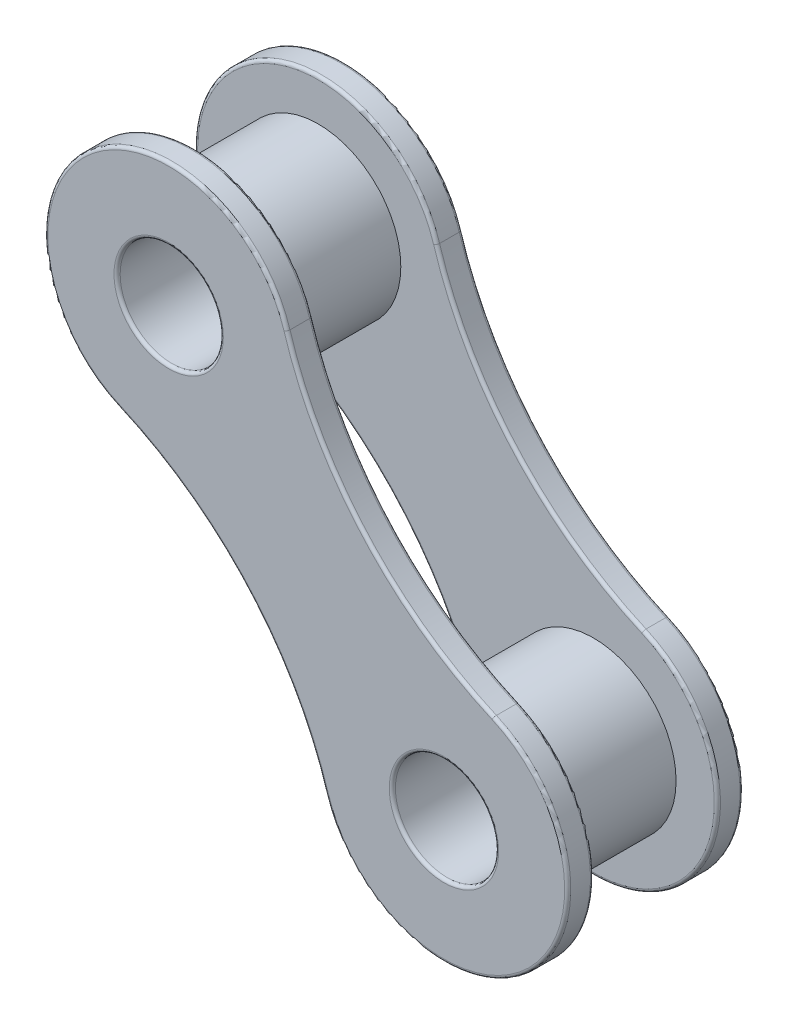
ISO-10303-21;
HEADER;
FILE_DESCRIPTION(('STEP AP214'),'2;1');
FILE_NAME('part.step','',(''),(''),'','','');
FILE_SCHEMA(('AUTOMOTIVE_DESIGN { 1 0 10303 214 1 1 1 1 }'));
ENDSEC;
DATA;
#1=APPLICATION_CONTEXT('core data for automotive mechanical design processes');
#2=APPLICATION_PROTOCOL_DEFINITION('international standard','automotive_design',2000,#1);
#3=PRODUCT_CONTEXT('',#1,'mechanical');
#4=PRODUCT('Part','Part','',(#3));
#5=PRODUCT_RELATED_PRODUCT_CATEGORY('part','',(#4));
#6=PRODUCT_DEFINITION_FORMATION('','',#4);
#7=PRODUCT_DEFINITION_CONTEXT('part definition',#1,'design');
#8=PRODUCT_DEFINITION('design','',#6,#7);
#9=PRODUCT_DEFINITION_SHAPE('','',#8);
#10=(LENGTH_UNIT() NAMED_UNIT(*) SI_UNIT(.MILLI.,.METRE.));
#11=(NAMED_UNIT(*) PLANE_ANGLE_UNIT() SI_UNIT($,.RADIAN.));
#12=(NAMED_UNIT(*) SI_UNIT($,.STERADIAN.) SOLID_ANGLE_UNIT());
#13=UNCERTAINTY_MEASURE_WITH_UNIT(LENGTH_MEASURE(1.E-05),#10,'distance_accuracy_value','');
#14=(GEOMETRIC_REPRESENTATION_CONTEXT(3) GLOBAL_UNCERTAINTY_ASSIGNED_CONTEXT((#13)) GLOBAL_UNIT_ASSIGNED_CONTEXT((#10,
#11,#12)) REPRESENTATION_CONTEXT('',''));
#15=CARTESIAN_POINT('',(0.,0.,0.));
#16=DIRECTION('',(0.,0.,1.));
#17=DIRECTION('',(1.,0.,0.));
#18=AXIS2_PLACEMENT_3D('',#15,#16,#17);
#19=CARTESIAN_POINT('',(63.2858407210555,49.9374865017428,3.));
#20=DIRECTION('',(0.,0.,1.));
#21=DIRECTION('',(1.,0.,0.));
#22=AXIS2_PLACEMENT_3D('',#19,#20,#21);
#23=PLANE('',#22);
#24=CARTESIAN_POINT('',(45.1534797470327,53.8384460641754,3.));
#25=DIRECTION('',(0.,0.,1.));
#26=DIRECTION('',(1.,0.,0.));
#27=AXIS2_PLACEMENT_3D('',#24,#25,#26);
#28=CIRCLE('',#27,5.85);
#29=CARTESIAN_POINT('',(42.8167210840747,48.4754190316973,3.));
#30=VERTEX_POINT('',#29);
#31=CARTESIAN_POINT('',(50.7416220659298,55.5691006870715,3.));
#32=VERTEX_POINT('',#31);
#33=EDGE_CURVE('E227',#30,#32,#28,.F.);
#34=ORIENTED_EDGE('',*,*,#33,.T.);
#35=CARTESIAN_POINT('',(68.0791918245591,60.9385675940056,3.));
#36=DIRECTION('',(0.,0.,1.));
#37=DIRECTION('',(1.,0.,0.));
#38=AXIS2_PLACEMENT_3D('',#35,#36,#37);
#39=CIRCLE('',#38,18.15);
#40=CARTESIAN_POINT('',(60.8292482805099,44.2994324419582,3.));
#41=VERTEX_POINT('',#40);
#42=EDGE_CURVE('E233',#32,#41,#39,.T.);
#43=ORIENTED_EDGE('',*,*,#42,.T.);
#44=CARTESIAN_POINT('',(58.4924896175519,38.9364054094801,3.));
#45=DIRECTION('',(0.,0.,1.));
#46=DIRECTION('',(1.,0.,0.));
#47=AXIS2_PLACEMENT_3D('',#44,#45,#46);
#48=CIRCLE('',#47,5.85000000000001);
#49=CARTESIAN_POINT('',(52.9043472986548,37.205750786584,3.));
#50=VERTEX_POINT('',#49);
#51=EDGE_CURVE('E231',#41,#50,#48,.F.);
#52=ORIENTED_EDGE('',*,*,#51,.T.);
#53=CARTESIAN_POINT('',(35.5667775400255,31.8362838796499,3.));
#54=DIRECTION('',(0.,0.,1.));
#55=DIRECTION('',(1.,0.,0.));
#56=AXIS2_PLACEMENT_3D('',#53,#54,#55);
#57=CIRCLE('',#56,18.15);
#58=EDGE_CURVE('E229',#50,#30,#57,.T.);
#59=ORIENTED_EDGE('',*,*,#58,.T.);
#60=EDGE_LOOP('',(#34,#43,#52,#59));
#61=FACE_BOUND('',#60,.T.);
#62=CARTESIAN_POINT('',(45.1534797470327,53.8384460641754,3.));
#63=DIRECTION('',(0.,0.,1.));
#64=DIRECTION('',(1.,0.,0.));
#65=AXIS2_PLACEMENT_3D('',#62,#63,#64);
#66=CIRCLE('',#65,4.00000000000001);
#67=CARTESIAN_POINT('',(49.1534797470327,53.8384460641754,3.));
#68=VERTEX_POINT('',#67);
#69=EDGE_CURVE('E337',#68,#68,#66,.T.);
#70=ORIENTED_EDGE('',*,*,#69,.T.);
#71=EDGE_LOOP('',(#70));
#72=FACE_BOUND('',#71,.T.);
#73=CARTESIAN_POINT('',(58.4924896175519,38.9364054094801,3.));
#74=DIRECTION('',(0.,0.,1.));
#75=DIRECTION('',(1.,0.,0.));
#76=AXIS2_PLACEMENT_3D('',#73,#74,#75);
#77=CIRCLE('',#76,4.);
#78=CARTESIAN_POINT('',(62.4924896175519,38.9364054094801,3.));
#79=VERTEX_POINT('',#78);
#80=EDGE_CURVE('E194',#79,#79,#77,.F.);
#81=ORIENTED_EDGE('',*,*,#80,.F.);
#82=EDGE_LOOP('',(#81));
#83=FACE_BOUND('',#82,.T.);
#84=ADVANCED_FACE('F36',(#61,#72,#83),#23,.F.);
#85=CARTESIAN_POINT('',(45.1534797470327,53.8384460641754,3.));
#86=DIRECTION('',(0.,0.,-1.));
#87=DIRECTION('',(-1.,0.,0.));
#88=AXIS2_PLACEMENT_3D('',#85,#86,#87);
#89=CYLINDRICAL_SURFACE('',#88,4.00000000000001);
#90=ORIENTED_EDGE('',*,*,#69,.F.);
#91=EDGE_LOOP('',(#90));
#92=FACE_BOUND('',#91,.T.);
#93=CARTESIAN_POINT('',(45.1534797470327,53.8384460641754,-3.));
#94=DIRECTION('',(0.,0.,1.));
#95=DIRECTION('',(1.,0.,0.));
#96=AXIS2_PLACEMENT_3D('',#93,#94,#95);
#97=CIRCLE('',#96,4.00000000000001);
#98=CARTESIAN_POINT('',(49.1534797470327,53.8384460641754,-3.));
#99=VERTEX_POINT('',#98);
#100=EDGE_CURVE('E331',#99,#99,#97,.T.);
#101=ORIENTED_EDGE('',*,*,#100,.T.);
#102=EDGE_LOOP('',(#101));
#103=FACE_BOUND('',#102,.T.);
#104=ADVANCED_FACE('F349',(#92,#103),#89,.T.);
#105=CARTESIAN_POINT('',(45.1534797470327,53.8384460641754,3.));
#106=DIRECTION('',(0.,0.,-1.));
#107=DIRECTION('',(-1.,0.,0.));
#108=AXIS2_PLACEMENT_3D('',#105,#106,#107);
#109=CYLINDRICAL_SURFACE('',#108,2.5);
#110=CARTESIAN_POINT('',(45.1534797470327,53.8384460641754,-4.1));
#111=DIRECTION('',(0.,0.,-1.));
#112=DIRECTION('',(-1.,0.,0.));
#113=AXIS2_PLACEMENT_3D('',#110,#111,#112);
#114=CIRCLE('',#113,2.5);
#115=CARTESIAN_POINT('',(42.6534797470327,53.8384460641754,-4.1));
#116=VERTEX_POINT('',#115);
#117=EDGE_CURVE('E259',#116,#116,#114,.T.);
#118=ORIENTED_EDGE('',*,*,#117,.T.);
#119=EDGE_LOOP('',(#118));
#120=FACE_BOUND('',#119,.T.);
#121=CARTESIAN_POINT('',(45.1534797470327,53.8384460641754,4.1));
#122=DIRECTION('',(0.,0.,1.));
#123=DIRECTION('',(1.,0.,0.));
#124=AXIS2_PLACEMENT_3D('',#121,#122,#123);
#125=CIRCLE('',#124,2.5);
#126=CARTESIAN_POINT('',(47.6534797470327,53.8384460641754,4.1));
#127=VERTEX_POINT('',#126);
#128=EDGE_CURVE('E256',#127,#127,#125,.T.);
#129=ORIENTED_EDGE('',*,*,#128,.T.);
#130=EDGE_LOOP('',(#129));
#131=FACE_BOUND('',#130,.T.);
#132=ADVANCED_FACE('F355',(#120,#131),#109,.F.);
#133=CARTESIAN_POINT('',(63.2858407210555,49.9374865017428,4.25));
#134=DIRECTION('',(0.,0.,1.));
#135=DIRECTION('',(1.,0.,0.));
#136=AXIS2_PLACEMENT_3D('',#133,#134,#135);
#137=PLANE('',#136);
#138=CARTESIAN_POINT('',(58.4924896175519,38.9364054094801,4.25));
#139=DIRECTION('',(0.,0.,1.));
#140=DIRECTION('',(1.,0.,0.));
#141=AXIS2_PLACEMENT_3D('',#138,#139,#140);
#142=CIRCLE('',#141,2.65);
#143=CARTESIAN_POINT('',(61.1424896175519,38.9364054094801,4.25));
#144=VERTEX_POINT('',#143);
#145=EDGE_CURVE('E253',#144,#144,#142,.F.);
#146=ORIENTED_EDGE('',*,*,#145,.T.);
#147=EDGE_LOOP('',(#146));
#148=FACE_BOUND('',#147,.T.);
#149=CARTESIAN_POINT('',(45.1534797470327,53.8384460641754,4.25));
#150=DIRECTION('',(0.,0.,1.));
#151=DIRECTION('',(1.,0.,0.));
#152=AXIS2_PLACEMENT_3D('',#149,#150,#151);
#153=CIRCLE('',#152,2.65);
#154=CARTESIAN_POINT('',(47.8034797470327,53.8384460641754,4.25));
#155=VERTEX_POINT('',#154);
#156=EDGE_CURVE('E250',#155,#155,#153,.F.);
#157=ORIENTED_EDGE('',*,*,#156,.T.);
#158=EDGE_LOOP('',(#157));
#159=FACE_BOUND('',#158,.T.);
#160=CARTESIAN_POINT('',(58.4924896175519,38.9364054094801,4.25));
#161=DIRECTION('',(0.,0.,1.));
#162=DIRECTION('',(1.,0.,0.));
#163=AXIS2_PLACEMENT_3D('',#160,#161,#162);
#164=CIRCLE('',#163,5.85000000000001);
#165=CARTESIAN_POINT('',(52.9043472986548,37.205750786584,4.25));
#166=VERTEX_POINT('',#165);
#167=CARTESIAN_POINT('',(60.8292482805099,44.2994324419582,4.25));
#168=VERTEX_POINT('',#167);
#169=EDGE_CURVE('E53',#166,#168,#164,.T.);
#170=ORIENTED_EDGE('',*,*,#169,.T.);
#171=CARTESIAN_POINT('',(68.0791918245591,60.9385675940056,4.25));
#172=DIRECTION('',(0.,0.,1.));
#173=DIRECTION('',(1.,0.,0.));
#174=AXIS2_PLACEMENT_3D('',#171,#172,#173);
#175=CIRCLE('',#174,18.15);
#176=CARTESIAN_POINT('',(50.7416220659298,55.5691006870715,4.25));
#177=VERTEX_POINT('',#176);
#178=EDGE_CURVE('E248',#168,#177,#175,.F.);
#179=ORIENTED_EDGE('',*,*,#178,.T.);
#180=CARTESIAN_POINT('',(45.1534797470327,53.8384460641754,4.25));
#181=DIRECTION('',(0.,0.,1.));
#182=DIRECTION('',(1.,0.,0.));
#183=AXIS2_PLACEMENT_3D('',#180,#181,#182);
#184=CIRCLE('',#183,5.85);
#185=CARTESIAN_POINT('',(42.8167210840747,48.4754190316973,4.25));
#186=VERTEX_POINT('',#185);
#187=EDGE_CURVE('E244',#177,#186,#184,.T.);
#188=ORIENTED_EDGE('',*,*,#187,.T.);
#189=CARTESIAN_POINT('',(35.5667775400255,31.8362838796499,4.25));
#190=DIRECTION('',(0.,0.,1.));
#191=DIRECTION('',(1.,0.,0.));
#192=AXIS2_PLACEMENT_3D('',#189,#190,#191);
#193=CIRCLE('',#192,18.15);
#194=EDGE_CURVE('E58',#186,#166,#193,.F.);
#195=ORIENTED_EDGE('',*,*,#194,.T.);
#196=EDGE_LOOP('',(#170,#179,#188,#195));
#197=FACE_BOUND('',#196,.T.);
#198=ADVANCED_FACE('F361',(#148,#159,#197),#137,.T.);
#199=CARTESIAN_POINT('',(58.4924896175519,38.9364054094801,4.25));
#200=DIRECTION('',(0.,0.,-1.));
#201=DIRECTION('',(-1.,0.,0.));
#202=AXIS2_PLACEMENT_3D('',#199,#200,#201);
#203=CYLINDRICAL_SURFACE('',#202,6.00000000000001);
#204=DIRECTION('',(0.,0.,-1.));
#205=VECTOR('',#204,1.);
#206=CARTESIAN_POINT('',(52.7610615981703,37.1613750270225,4.25));
#207=LINE('',#206,#205);
#208=CARTESIAN_POINT('',(52.7610615981703,37.1613750270225,4.1));
#209=VERTEX_POINT('',#208);
#210=CARTESIAN_POINT('',(52.7610615981703,37.1613750270225,3.15));
#211=VERTEX_POINT('',#210);
#212=EDGE_CURVE('E321',#209,#211,#207,.T.);
#213=ORIENTED_EDGE('',*,*,#212,.T.);
#214=CARTESIAN_POINT('',(58.4924896175519,38.9364054094801,3.15));
#215=DIRECTION('',(0.,0.,1.));
#216=DIRECTION('',(1.,0.,0.));
#217=AXIS2_PLACEMENT_3D('',#214,#215,#216);
#218=CIRCLE('',#217,6.00000000000001);
#219=CARTESIAN_POINT('',(60.8891651693037,44.4369459556115,3.15));
#220=VERTEX_POINT('',#219);
#221=EDGE_CURVE('E238',#211,#220,#218,.T.);
#222=ORIENTED_EDGE('',*,*,#221,.T.);
#223=DIRECTION('',(0.,0.,-1.));
#224=VECTOR('',#223,1.);
#225=CARTESIAN_POINT('',(60.8891651693037,44.4369459556115,4.25));
#226=LINE('',#225,#224);
#227=CARTESIAN_POINT('',(60.8891651693037,44.4369459556115,4.1));
#228=VERTEX_POINT('',#227);
#229=EDGE_CURVE('E329',#228,#220,#226,.T.);
#230=ORIENTED_EDGE('',*,*,#229,.F.);
#231=CARTESIAN_POINT('',(58.4924896175519,38.9364054094801,4.1));
#232=DIRECTION('',(0.,0.,1.));
#233=DIRECTION('',(1.,0.,0.));
#234=AXIS2_PLACEMENT_3D('',#231,#232,#233);
#235=CIRCLE('',#234,6.00000000000001);
#236=EDGE_CURVE('E236',#228,#209,#235,.F.);
#237=ORIENTED_EDGE('',*,*,#236,.T.);
#238=EDGE_LOOP('',(#213,#222,#230,#237));
#239=FACE_BOUND('',#238,.T.);
#240=ADVANCED_FACE('F371',(#239),#203,.T.);
#241=CARTESIAN_POINT('',(68.0791918245591,60.9385675940056,4.25));
#242=DIRECTION('',(0.,0.,-1.));
#243=DIRECTION('',(-1.,0.,0.));
#244=AXIS2_PLACEMENT_3D('',#241,#242,#243);
#245=CYLINDRICAL_SURFACE('',#244,18.);
#246=ORIENTED_EDGE('',*,*,#229,.T.);
#247=CARTESIAN_POINT('',(68.0791918245591,60.9385675940056,3.15));
#248=DIRECTION('',(0.,0.,1.));
#249=DIRECTION('',(1.,0.,0.));
#250=AXIS2_PLACEMENT_3D('',#247,#248,#249);
#251=CIRCLE('',#250,18.);
#252=CARTESIAN_POINT('',(50.8849077664143,55.6134764466329,3.15));
#253=VERTEX_POINT('',#252);
#254=EDGE_CURVE('E224',#220,#253,#251,.F.);
#255=ORIENTED_EDGE('',*,*,#254,.T.);
#256=DIRECTION('',(0.,0.,-1.));
#257=VECTOR('',#256,1.);
#258=CARTESIAN_POINT('',(50.8849077664143,55.6134764466329,4.25));
#259=LINE('',#258,#257);
#260=CARTESIAN_POINT('',(50.8849077664143,55.6134764466329,4.1));
#261=VERTEX_POINT('',#260);
#262=EDGE_CURVE('E327',#261,#253,#259,.T.);
#263=ORIENTED_EDGE('',*,*,#262,.F.);
#264=CARTESIAN_POINT('',(68.0791918245591,60.9385675940056,4.1));
#265=DIRECTION('',(0.,0.,1.));
#266=DIRECTION('',(1.,0.,0.));
#267=AXIS2_PLACEMENT_3D('',#264,#265,#266);
#268=CIRCLE('',#267,18.);
#269=EDGE_CURVE('E221',#261,#228,#268,.T.);
#270=ORIENTED_EDGE('',*,*,#269,.T.);
#271=EDGE_LOOP('',(#246,#255,#263,#270));
#272=FACE_BOUND('',#271,.T.);
#273=ADVANCED_FACE('F368',(#272),#245,.F.);
#274=CARTESIAN_POINT('',(45.1534797470327,53.8384460641754,4.25));
#275=DIRECTION('',(0.,0.,-1.));
#276=DIRECTION('',(-1.,0.,0.));
#277=AXIS2_PLACEMENT_3D('',#274,#275,#276);
#278=CYLINDRICAL_SURFACE('',#277,6.00000000000001);
#279=ORIENTED_EDGE('',*,*,#262,.T.);
#280=CARTESIAN_POINT('',(45.1534797470327,53.8384460641754,3.15));
#281=DIRECTION('',(0.,0.,1.));
#282=DIRECTION('',(1.,0.,0.));
#283=AXIS2_PLACEMENT_3D('',#280,#281,#282);
#284=CIRCLE('',#283,6.00000000000001);
#285=CARTESIAN_POINT('',(42.7568041952809,48.337905518044,3.15));
#286=VERTEX_POINT('',#285);
#287=EDGE_CURVE('E11',#253,#286,#284,.T.);
#288=ORIENTED_EDGE('',*,*,#287,.T.);
#289=DIRECTION('',(0.,0.,-1.));
#290=VECTOR('',#289,1.);
#291=CARTESIAN_POINT('',(42.7568041952809,48.337905518044,4.25));
#292=LINE('',#291,#290);
#293=CARTESIAN_POINT('',(42.7568041952809,48.337905518044,4.1));
#294=VERTEX_POINT('',#293);
#295=EDGE_CURVE('E318',#294,#286,#292,.T.);
#296=ORIENTED_EDGE('',*,*,#295,.F.);
#297=CARTESIAN_POINT('',(45.1534797470327,53.8384460641754,4.1));
#298=DIRECTION('',(0.,0.,1.));
#299=DIRECTION('',(1.,0.,0.));
#300=AXIS2_PLACEMENT_3D('',#297,#298,#299);
#301=CIRCLE('',#300,6.00000000000001);
#302=EDGE_CURVE('E45',#294,#261,#301,.F.);
#303=ORIENTED_EDGE('',*,*,#302,.T.);
#304=EDGE_LOOP('',(#279,#288,#296,#303));
#305=FACE_BOUND('',#304,.T.);
#306=ADVANCED_FACE('F324',(#305),#278,.T.);
#307=CARTESIAN_POINT('',(35.5667775400255,31.8362838796499,4.25));
#308=DIRECTION('',(0.,0.,-1.));
#309=DIRECTION('',(-1.,0.,0.));
#310=AXIS2_PLACEMENT_3D('',#307,#308,#309);
#311=CYLINDRICAL_SURFACE('',#310,18.);
#312=ORIENTED_EDGE('',*,*,#295,.T.);
#313=CARTESIAN_POINT('',(35.5667775400255,31.8362838796499,3.15));
#314=DIRECTION('',(0.,0.,1.));
#315=DIRECTION('',(1.,0.,0.));
#316=AXIS2_PLACEMENT_3D('',#313,#314,#315);
#317=CIRCLE('',#316,18.);
#318=EDGE_CURVE('E242',#286,#211,#317,.F.);
#319=ORIENTED_EDGE('',*,*,#318,.T.);
#320=ORIENTED_EDGE('',*,*,#212,.F.);
#321=CARTESIAN_POINT('',(35.5667775400255,31.8362838796499,4.1));
#322=DIRECTION('',(0.,0.,1.));
#323=DIRECTION('',(1.,0.,0.));
#324=AXIS2_PLACEMENT_3D('',#321,#322,#323);
#325=CIRCLE('',#324,18.);
#326=EDGE_CURVE('E240',#209,#294,#325,.T.);
#327=ORIENTED_EDGE('',*,*,#326,.T.);
#328=EDGE_LOOP('',(#312,#319,#320,#327));
#329=FACE_BOUND('',#328,.T.);
#330=ADVANCED_FACE('F317',(#329),#311,.F.);
#331=CARTESIAN_POINT('',(58.4924896175519,38.9364054094801,4.25));
#332=DIRECTION('',(0.,0.,-1.));
#333=DIRECTION('',(-1.,0.,0.));
#334=AXIS2_PLACEMENT_3D('',#331,#332,#333);
#335=CYLINDRICAL_SURFACE('',#334,2.5);
#336=CARTESIAN_POINT('',(58.4924896175519,38.9364054094801,-4.1));
#337=DIRECTION('',(0.,0.,-1.));
#338=DIRECTION('',(-1.,0.,0.));
#339=AXIS2_PLACEMENT_3D('',#336,#337,#338);
#340=CIRCLE('',#339,2.5);
#341=CARTESIAN_POINT('',(55.9924896175519,38.9364054094801,-4.1));
#342=VERTEX_POINT('',#341);
#343=EDGE_CURVE('E265',#342,#342,#340,.T.);
#344=ORIENTED_EDGE('',*,*,#343,.T.);
#345=EDGE_LOOP('',(#344));
#346=FACE_BOUND('',#345,.T.);
#347=CARTESIAN_POINT('',(58.4924896175519,38.9364054094801,4.1));
#348=DIRECTION('',(0.,0.,1.));
#349=DIRECTION('',(1.,0.,0.));
#350=AXIS2_PLACEMENT_3D('',#347,#348,#349);
#351=CIRCLE('',#350,2.5);
#352=CARTESIAN_POINT('',(60.9924896175519,38.9364054094801,4.1));
#353=VERTEX_POINT('',#352);
#354=EDGE_CURVE('E262',#353,#353,#351,.T.);
#355=ORIENTED_EDGE('',*,*,#354,.T.);
#356=EDGE_LOOP('',(#355));
#357=FACE_BOUND('',#356,.T.);
#358=ADVANCED_FACE('F365',(#346,#357),#335,.F.);
#359=CARTESIAN_POINT('',(58.4924896175519,38.9364054094801,3.));
#360=DIRECTION('',(0.,0.,-1.));
#361=DIRECTION('',(-1.,0.,0.));
#362=AXIS2_PLACEMENT_3D('',#359,#360,#361);
#363=CYLINDRICAL_SURFACE('',#362,4.);
#364=ORIENTED_EDGE('',*,*,#80,.T.);
#365=EDGE_LOOP('',(#364));
#366=FACE_BOUND('',#365,.T.);
#367=CARTESIAN_POINT('',(58.4924896175519,38.9364054094801,-3.));
#368=DIRECTION('',(0.,0.,1.));
#369=DIRECTION('',(1.,0.,0.));
#370=AXIS2_PLACEMENT_3D('',#367,#368,#369);
#371=CIRCLE('',#370,4.);
#372=CARTESIAN_POINT('',(62.4924896175519,38.9364054094801,-3.));
#373=VERTEX_POINT('',#372);
#374=EDGE_CURVE('E341',#373,#373,#371,.T.);
#375=ORIENTED_EDGE('',*,*,#374,.T.);
#376=EDGE_LOOP('',(#375));
#377=FACE_BOUND('',#376,.T.);
#378=ADVANCED_FACE('F345',(#366,#377),#363,.T.);
#379=CARTESIAN_POINT('',(58.4924896175519,38.9364054094801,-4.25));
#380=DIRECTION('',(0.,0.,1.));
#381=DIRECTION('',(1.,0.,0.));
#382=AXIS2_PLACEMENT_3D('',#379,#380,#381);
#383=CYLINDRICAL_SURFACE('',#382,6.00000000000001);
#384=DIRECTION('',(0.,0.,1.));
#385=VECTOR('',#384,1.);
#386=CARTESIAN_POINT('',(52.7610615981703,37.1613750270225,-4.25));
#387=LINE('',#386,#385);
#388=CARTESIAN_POINT('',(52.7610615981703,37.1613750270225,-4.1));
#389=VERTEX_POINT('',#388);
#390=CARTESIAN_POINT('',(52.7610615981703,37.1613750270225,-3.15));
#391=VERTEX_POINT('',#390);
#392=EDGE_CURVE('E156',#389,#391,#387,.T.);
#393=ORIENTED_EDGE('',*,*,#392,.F.);
#394=CARTESIAN_POINT('',(58.4924896175519,38.9364054094801,-4.1));
#395=DIRECTION('',(0.,0.,-1.));
#396=DIRECTION('',(-1.,0.,0.));
#397=AXIS2_PLACEMENT_3D('',#394,#395,#396);
#398=CIRCLE('',#397,6.00000000000001);
#399=CARTESIAN_POINT('',(60.8891651693037,44.4369459556115,-4.1));
#400=VERTEX_POINT('',#399);
#401=EDGE_CURVE('E151',#389,#400,#398,.F.);
#402=ORIENTED_EDGE('',*,*,#401,.T.);
#403=DIRECTION('',(0.,0.,1.));
#404=VECTOR('',#403,1.);
#405=CARTESIAN_POINT('',(60.8891651693037,44.4369459556115,-4.25));
#406=LINE('',#405,#404);
#407=CARTESIAN_POINT('',(60.8891651693037,44.4369459556115,-3.15));
#408=VERTEX_POINT('',#407);
#409=EDGE_CURVE('E154',#400,#408,#406,.T.);
#410=ORIENTED_EDGE('',*,*,#409,.T.);
#411=CARTESIAN_POINT('',(58.4924896175519,38.9364054094801,-3.15));
#412=DIRECTION('',(0.,0.,-1.));
#413=DIRECTION('',(-1.,0.,0.));
#414=AXIS2_PLACEMENT_3D('',#411,#412,#413);
#415=CIRCLE('',#414,6.00000000000001);
#416=EDGE_CURVE('E162',#408,#391,#415,.T.);
#417=ORIENTED_EDGE('',*,*,#416,.T.);
#418=EDGE_LOOP('',(#393,#402,#410,#417));
#419=FACE_BOUND('',#418,.T.);
#420=ADVANCED_FACE('F153',(#419),#383,.T.);
#421=CARTESIAN_POINT('',(35.5667775400255,31.8362838796499,-4.25));
#422=DIRECTION('',(0.,0.,1.));
#423=DIRECTION('',(1.,0.,0.));
#424=AXIS2_PLACEMENT_3D('',#421,#422,#423);
#425=CYLINDRICAL_SURFACE('',#424,18.);
#426=DIRECTION('',(0.,0.,1.));
#427=VECTOR('',#426,1.);
#428=CARTESIAN_POINT('',(42.7568041952809,48.337905518044,-4.25));
#429=LINE('',#428,#427);
#430=CARTESIAN_POINT('',(42.7568041952809,48.337905518044,-4.1));
#431=VERTEX_POINT('',#430);
#432=CARTESIAN_POINT('',(42.7568041952809,48.337905518044,-3.15));
#433=VERTEX_POINT('',#432);
#434=EDGE_CURVE('E489',#431,#433,#429,.T.);
#435=ORIENTED_EDGE('',*,*,#434,.F.);
#436=CARTESIAN_POINT('',(35.5667775400255,31.8362838796499,-4.1));
#437=DIRECTION('',(0.,0.,-1.));
#438=DIRECTION('',(-1.,0.,0.));
#439=AXIS2_PLACEMENT_3D('',#436,#437,#438);
#440=CIRCLE('',#439,18.);
#441=EDGE_CURVE('E210',#431,#389,#440,.T.);
#442=ORIENTED_EDGE('',*,*,#441,.T.);
#443=ORIENTED_EDGE('',*,*,#392,.T.);
#444=CARTESIAN_POINT('',(35.5667775400255,31.8362838796499,-3.15));
#445=DIRECTION('',(0.,0.,-1.));
#446=DIRECTION('',(-1.,0.,0.));
#447=AXIS2_PLACEMENT_3D('',#444,#445,#446);
#448=CIRCLE('',#447,18.);
#449=EDGE_CURVE('E161',#391,#433,#448,.F.);
#450=ORIENTED_EDGE('',*,*,#449,.T.);
#451=EDGE_LOOP('',(#435,#442,#443,#450));
#452=FACE_BOUND('',#451,.T.);
#453=ADVANCED_FACE('F462',(#452),#425,.F.);
#454=CARTESIAN_POINT('',(45.1534797470327,53.8384460641754,-4.25));
#455=DIRECTION('',(0.,0.,1.));
#456=DIRECTION('',(1.,0.,0.));
#457=AXIS2_PLACEMENT_3D('',#454,#455,#456);
#458=CYLINDRICAL_SURFACE('',#457,6.00000000000001);
#459=DIRECTION('',(0.,0.,1.));
#460=VECTOR('',#459,1.);
#461=CARTESIAN_POINT('',(50.8849077664143,55.6134764466329,-4.25));
#462=LINE('',#461,#460);
#463=CARTESIAN_POINT('',(50.8849077664143,55.6134764466329,-4.1));
#464=VERTEX_POINT('',#463);
#465=CARTESIAN_POINT('',(50.8849077664143,55.6134764466329,-3.15));
#466=VERTEX_POINT('',#465);
#467=EDGE_CURVE('E174',#464,#466,#462,.T.);
#468=ORIENTED_EDGE('',*,*,#467,.F.);
#469=CARTESIAN_POINT('',(45.1534797470327,53.8384460641754,-4.1));
#470=DIRECTION('',(0.,0.,-1.));
#471=DIRECTION('',(-1.,0.,0.));
#472=AXIS2_PLACEMENT_3D('',#469,#470,#471);
#473=CIRCLE('',#472,6.00000000000001);
#474=EDGE_CURVE('E270',#464,#431,#473,.F.);
#475=ORIENTED_EDGE('',*,*,#474,.T.);
#476=ORIENTED_EDGE('',*,*,#434,.T.);
#477=CARTESIAN_POINT('',(45.1534797470327,53.8384460641754,-3.15));
#478=DIRECTION('',(0.,0.,-1.));
#479=DIRECTION('',(-1.,0.,0.));
#480=AXIS2_PLACEMENT_3D('',#477,#478,#479);
#481=CIRCLE('',#480,6.00000000000001);
#482=EDGE_CURVE('E268',#433,#466,#481,.T.);
#483=ORIENTED_EDGE('',*,*,#482,.T.);
#484=EDGE_LOOP('',(#468,#475,#476,#483));
#485=FACE_BOUND('',#484,.T.);
#486=ADVANCED_FACE('F465',(#485),#458,.T.);
#487=CARTESIAN_POINT('',(68.0791918245591,60.9385675940056,-4.25));
#488=DIRECTION('',(0.,0.,1.));
#489=DIRECTION('',(1.,0.,0.));
#490=AXIS2_PLACEMENT_3D('',#487,#488,#489);
#491=CYLINDRICAL_SURFACE('',#490,18.);
#492=ORIENTED_EDGE('',*,*,#409,.F.);
#493=CARTESIAN_POINT('',(68.0791918245591,60.9385675940056,-4.1));
#494=DIRECTION('',(0.,0.,-1.));
#495=DIRECTION('',(-1.,0.,0.));
#496=AXIS2_PLACEMENT_3D('',#493,#494,#495);
#497=CIRCLE('',#496,18.);
#498=EDGE_CURVE('E170',#400,#464,#497,.T.);
#499=ORIENTED_EDGE('',*,*,#498,.T.);
#500=ORIENTED_EDGE('',*,*,#467,.T.);
#501=CARTESIAN_POINT('',(68.0791918245591,60.9385675940056,-3.15));
#502=DIRECTION('',(0.,0.,-1.));
#503=DIRECTION('',(-1.,0.,0.));
#504=AXIS2_PLACEMENT_3D('',#501,#502,#503);
#505=CIRCLE('',#504,18.);
#506=EDGE_CURVE('E173',#466,#408,#505,.F.);
#507=ORIENTED_EDGE('',*,*,#506,.T.);
#508=EDGE_LOOP('',(#492,#499,#500,#507));
#509=FACE_BOUND('',#508,.T.);
#510=ADVANCED_FACE('F167',(#509),#491,.F.);
#511=CARTESIAN_POINT('',(63.2858407210555,49.9374865017428,-4.25));
#512=DIRECTION('',(0.,0.,-1.));
#513=DIRECTION('',(1.,0.,0.));
#514=AXIS2_PLACEMENT_3D('',#511,#512,#513);
#515=PLANE('',#514);
#516=CARTESIAN_POINT('',(45.1534797470327,53.8384460641754,-4.25));
#517=DIRECTION('',(0.,0.,-1.));
#518=DIRECTION('',(-1.,0.,0.));
#519=AXIS2_PLACEMENT_3D('',#516,#517,#518);
#520=CIRCLE('',#519,2.65);
#521=CARTESIAN_POINT('',(42.5034797470327,53.8384460641754,-4.25));
#522=VERTEX_POINT('',#521);
#523=EDGE_CURVE('E205',#522,#522,#520,.F.);
#524=ORIENTED_EDGE('',*,*,#523,.T.);
#525=EDGE_LOOP('',(#524));
#526=FACE_BOUND('',#525,.T.);
#527=CARTESIAN_POINT('',(58.4924896175519,38.9364054094801,-4.25));
#528=DIRECTION('',(0.,0.,-1.));
#529=DIRECTION('',(-1.,0.,0.));
#530=AXIS2_PLACEMENT_3D('',#527,#528,#529);
#531=CIRCLE('',#530,2.65);
#532=CARTESIAN_POINT('',(55.8424896175519,38.9364054094801,-4.25));
#533=VERTEX_POINT('',#532);
#534=EDGE_CURVE('E202',#533,#533,#531,.F.);
#535=ORIENTED_EDGE('',*,*,#534,.T.);
#536=EDGE_LOOP('',(#535));
#537=FACE_BOUND('',#536,.T.);
#538=CARTESIAN_POINT('',(45.1534797470327,53.8384460641754,-4.25));
#539=DIRECTION('',(0.,0.,-1.));
#540=DIRECTION('',(-1.,0.,0.));
#541=AXIS2_PLACEMENT_3D('',#538,#539,#540);
#542=CIRCLE('',#541,5.85);
#543=CARTESIAN_POINT('',(42.8167210840747,48.4754190316973,-4.25));
#544=VERTEX_POINT('',#543);
#545=CARTESIAN_POINT('',(50.7416220659298,55.5691006870715,-4.25));
#546=VERTEX_POINT('',#545);
#547=EDGE_CURVE('E190',#544,#546,#542,.T.);
#548=ORIENTED_EDGE('',*,*,#547,.T.);
#549=CARTESIAN_POINT('',(68.0791918245591,60.9385675940056,-4.25));
#550=DIRECTION('',(0.,0.,-1.));
#551=DIRECTION('',(-1.,0.,0.));
#552=AXIS2_PLACEMENT_3D('',#549,#550,#551);
#553=CIRCLE('',#552,18.15);
#554=CARTESIAN_POINT('',(60.8292482805099,44.2994324419582,-4.25));
#555=VERTEX_POINT('',#554);
#556=EDGE_CURVE('E200',#546,#555,#553,.F.);
#557=ORIENTED_EDGE('',*,*,#556,.T.);
#558=CARTESIAN_POINT('',(58.4924896175519,38.9364054094801,-4.25));
#559=DIRECTION('',(0.,0.,-1.));
#560=DIRECTION('',(-1.,0.,0.));
#561=AXIS2_PLACEMENT_3D('',#558,#559,#560);
#562=CIRCLE('',#561,5.85000000000001);
#563=CARTESIAN_POINT('',(52.9043472986548,37.205750786584,-4.25));
#564=VERTEX_POINT('',#563);
#565=EDGE_CURVE('E180',#555,#564,#562,.T.);
#566=ORIENTED_EDGE('',*,*,#565,.T.);
#567=CARTESIAN_POINT('',(35.5667775400255,31.8362838796499,-4.25));
#568=DIRECTION('',(0.,0.,-1.));
#569=DIRECTION('',(-1.,0.,0.));
#570=AXIS2_PLACEMENT_3D('',#567,#568,#569);
#571=CIRCLE('',#570,18.15);
#572=EDGE_CURVE('E192',#564,#544,#571,.F.);
#573=ORIENTED_EDGE('',*,*,#572,.T.);
#574=EDGE_LOOP('',(#548,#557,#566,#573));
#575=FACE_BOUND('',#574,.T.);
#576=ADVANCED_FACE('F472',(#526,#537,#575),#515,.T.);
#577=CARTESIAN_POINT('',(63.2858407210555,49.9374865017428,-3.));
#578=DIRECTION('',(0.,0.,-1.));
#579=DIRECTION('',(1.,0.,0.));
#580=AXIS2_PLACEMENT_3D('',#577,#578,#579);
#581=PLANE('',#580);
#582=CARTESIAN_POINT('',(58.4924896175519,38.9364054094801,-3.));
#583=DIRECTION('',(0.,0.,-1.));
#584=DIRECTION('',(-1.,0.,0.));
#585=AXIS2_PLACEMENT_3D('',#582,#583,#584);
#586=CIRCLE('',#585,5.85000000000001);
#587=CARTESIAN_POINT('',(52.9043472986548,37.205750786584,-3.));
#588=VERTEX_POINT('',#587);
#589=CARTESIAN_POINT('',(60.8292482805099,44.2994324419582,-3.));
#590=VERTEX_POINT('',#589);
#591=EDGE_CURVE('E216',#588,#590,#586,.F.);
#592=ORIENTED_EDGE('',*,*,#591,.T.);
#593=CARTESIAN_POINT('',(68.0791918245591,60.9385675940056,-3.));
#594=DIRECTION('',(0.,0.,-1.));
#595=DIRECTION('',(-1.,0.,0.));
#596=AXIS2_PLACEMENT_3D('',#593,#594,#595);
#597=CIRCLE('',#596,18.15);
#598=CARTESIAN_POINT('',(50.7416220659298,55.5691006870715,-3.));
#599=VERTEX_POINT('',#598);
#600=EDGE_CURVE('E218',#590,#599,#597,.T.);
#601=ORIENTED_EDGE('',*,*,#600,.T.);
#602=CARTESIAN_POINT('',(45.1534797470327,53.8384460641754,-3.));
#603=DIRECTION('',(0.,0.,-1.));
#604=DIRECTION('',(-1.,0.,0.));
#605=AXIS2_PLACEMENT_3D('',#602,#603,#604);
#606=CIRCLE('',#605,5.85);
#607=CARTESIAN_POINT('',(42.8167210840747,48.4754190316973,-3.));
#608=VERTEX_POINT('',#607);
#609=EDGE_CURVE('E212',#599,#608,#606,.F.);
#610=ORIENTED_EDGE('',*,*,#609,.T.);
#611=CARTESIAN_POINT('',(35.5667775400255,31.8362838796499,-3.));
#612=DIRECTION('',(0.,0.,-1.));
#613=DIRECTION('',(-1.,0.,0.));
#614=AXIS2_PLACEMENT_3D('',#611,#612,#613);
#615=CIRCLE('',#614,18.15);
#616=EDGE_CURVE('E214',#608,#588,#615,.T.);
#617=ORIENTED_EDGE('',*,*,#616,.T.);
#618=EDGE_LOOP('',(#592,#601,#610,#617));
#619=FACE_BOUND('',#618,.T.);
#620=ORIENTED_EDGE('',*,*,#100,.F.);
#621=EDGE_LOOP('',(#620));
#622=FACE_BOUND('',#621,.T.);
#623=ORIENTED_EDGE('',*,*,#374,.F.);
#624=EDGE_LOOP('',(#623));
#625=FACE_BOUND('',#624,.T.);
#626=ADVANCED_FACE('F391',(#619,#622,#625),#581,.F.);
#627=CARTESIAN_POINT('',(35.5667775400255,31.8362838796499,-4.1));
#628=DIRECTION('',(0.,0.,-1.));
#629=DIRECTION('',(-1.,0.,0.));
#630=AXIS2_PLACEMENT_3D('',#627,#628,#629);
#631=TOROIDAL_SURFACE('',#630,18.15,0.15);
#632=CARTESIAN_POINT('',(42.8167210840747,48.4754190316973,-4.1));
#633=DIRECTION('',(-0.916756757688562,0.399445925291968,0.));
#634=DIRECTION('',(-0.399445925291968,-0.916756757688562,0.));
#635=AXIS2_PLACEMENT_3D('',#632,#633,#634);
#636=CIRCLE('',#635,0.15);
#637=EDGE_CURVE('E184',#544,#431,#636,.T.);
#638=ORIENTED_EDGE('',*,*,#637,.F.);
#639=ORIENTED_EDGE('',*,*,#572,.F.);
#640=CARTESIAN_POINT('',(52.9043472986548,37.205750786584,-4.1));
#641=DIRECTION('',(0.295838397076274,-0.955238003230263,0.));
#642=DIRECTION('',(0.955238003230264,0.295838397076274,0.));
#643=AXIS2_PLACEMENT_3D('',#640,#641,#642);
#644=CIRCLE('',#643,0.15);
#645=EDGE_CURVE('E175',#389,#564,#644,.T.);
#646=ORIENTED_EDGE('',*,*,#645,.F.);
#647=ORIENTED_EDGE('',*,*,#441,.F.);
#648=EDGE_LOOP('',(#638,#639,#646,#647));
#649=FACE_BOUND('',#648,.T.);
#650=ADVANCED_FACE('F388',(#649),#631,.T.);
#651=CARTESIAN_POINT('',(58.4924896175519,38.9364054094801,-4.1));
#652=DIRECTION('',(0.,0.,-1.));
#653=DIRECTION('',(-1.,0.,0.));
#654=AXIS2_PLACEMENT_3D('',#651,#652,#653);
#655=TOROIDAL_SURFACE('',#654,5.85000000000001,0.15);
#656=ORIENTED_EDGE('',*,*,#645,.T.);
#657=ORIENTED_EDGE('',*,*,#565,.F.);
#658=CARTESIAN_POINT('',(60.8292482805099,44.2994324419582,-4.1));
#659=DIRECTION('',(-0.916756757688562,0.399445925291968,0.));
#660=DIRECTION('',(-0.399445925291968,-0.916756757688562,0.));
#661=AXIS2_PLACEMENT_3D('',#658,#659,#660);
#662=CIRCLE('',#661,0.15);
#663=EDGE_CURVE('E178',#400,#555,#662,.T.);
#664=ORIENTED_EDGE('',*,*,#663,.F.);
#665=ORIENTED_EDGE('',*,*,#401,.F.);
#666=EDGE_LOOP('',(#656,#657,#664,#665));
#667=FACE_BOUND('',#666,.T.);
#668=ADVANCED_FACE('F179',(#667),#655,.T.);
#669=CARTESIAN_POINT('',(45.1534797470327,53.8384460641754,-4.1));
#670=DIRECTION('',(0.,0.,-1.));
#671=DIRECTION('',(-1.,0.,0.));
#672=AXIS2_PLACEMENT_3D('',#669,#670,#671);
#673=TOROIDAL_SURFACE('',#672,5.85,0.15);
#674=ORIENTED_EDGE('',*,*,#637,.T.);
#675=ORIENTED_EDGE('',*,*,#474,.F.);
#676=CARTESIAN_POINT('',(50.7416220659298,55.5691006870715,-4.1));
#677=DIRECTION('',(0.295838397076274,-0.955238003230263,0.));
#678=DIRECTION('',(0.955238003230264,0.295838397076274,0.));
#679=AXIS2_PLACEMENT_3D('',#676,#677,#678);
#680=CIRCLE('',#679,0.15);
#681=EDGE_CURVE('E185',#546,#464,#680,.T.);
#682=ORIENTED_EDGE('',*,*,#681,.F.);
#683=ORIENTED_EDGE('',*,*,#547,.F.);
#684=EDGE_LOOP('',(#674,#675,#682,#683));
#685=FACE_BOUND('',#684,.T.);
#686=ADVANCED_FACE('F382',(#685),#673,.T.);
#687=CARTESIAN_POINT('',(68.0791918245591,60.9385675940056,-4.1));
#688=DIRECTION('',(0.,0.,-1.));
#689=DIRECTION('',(-1.,0.,0.));
#690=AXIS2_PLACEMENT_3D('',#687,#688,#689);
#691=TOROIDAL_SURFACE('',#690,18.15,0.15);
#692=ORIENTED_EDGE('',*,*,#663,.T.);
#693=ORIENTED_EDGE('',*,*,#556,.F.);
#694=ORIENTED_EDGE('',*,*,#681,.T.);
#695=ORIENTED_EDGE('',*,*,#498,.F.);
#696=EDGE_LOOP('',(#692,#693,#694,#695));
#697=FACE_BOUND('',#696,.T.);
#698=ADVANCED_FACE('F187',(#697),#691,.T.);
#699=CARTESIAN_POINT('',(35.5667775400255,31.8362838796499,-3.15));
#700=DIRECTION('',(0.,0.,-1.));
#701=DIRECTION('',(-1.,0.,0.));
#702=AXIS2_PLACEMENT_3D('',#699,#700,#701);
#703=TOROIDAL_SURFACE('',#702,18.15,0.15);
#704=CARTESIAN_POINT('',(42.8167210840747,48.4754190316973,-3.15));
#705=DIRECTION('',(-0.916756757688562,0.399445925291968,0.));
#706=DIRECTION('',(-0.399445925291968,-0.916756757688562,0.));
#707=AXIS2_PLACEMENT_3D('',#704,#705,#706);
#708=CIRCLE('',#707,0.15);
#709=EDGE_CURVE('E283',#433,#608,#708,.T.);
#710=ORIENTED_EDGE('',*,*,#709,.F.);
#711=ORIENTED_EDGE('',*,*,#449,.F.);
#712=CARTESIAN_POINT('',(52.9043472986548,37.205750786584,-3.15));
#713=DIRECTION('',(0.295838397076274,-0.955238003230263,0.));
#714=DIRECTION('',(0.955238003230264,0.295838397076274,0.));
#715=AXIS2_PLACEMENT_3D('',#712,#713,#714);
#716=CIRCLE('',#715,0.15);
#717=EDGE_CURVE('E273',#588,#391,#716,.T.);
#718=ORIENTED_EDGE('',*,*,#717,.F.);
#719=ORIENTED_EDGE('',*,*,#616,.F.);
#720=EDGE_LOOP('',(#710,#711,#718,#719));
#721=FACE_BOUND('',#720,.T.);
#722=ADVANCED_FACE('F381',(#721),#703,.T.);
#723=CARTESIAN_POINT('',(58.4924896175519,38.9364054094801,-3.15));
#724=DIRECTION('',(0.,0.,-1.));
#725=DIRECTION('',(-1.,0.,0.));
#726=AXIS2_PLACEMENT_3D('',#723,#724,#725);
#727=TOROIDAL_SURFACE('',#726,5.85000000000001,0.15);
#728=ORIENTED_EDGE('',*,*,#717,.T.);
#729=ORIENTED_EDGE('',*,*,#416,.F.);
#730=CARTESIAN_POINT('',(60.8292482805099,44.2994324419582,-3.15));
#731=DIRECTION('',(-0.916756757688562,0.399445925291968,0.));
#732=DIRECTION('',(-0.399445925291968,-0.916756757688562,0.));
#733=AXIS2_PLACEMENT_3D('',#730,#731,#732);
#734=CIRCLE('',#733,0.15);
#735=EDGE_CURVE('E280',#590,#408,#734,.T.);
#736=ORIENTED_EDGE('',*,*,#735,.F.);
#737=ORIENTED_EDGE('',*,*,#591,.F.);
#738=EDGE_LOOP('',(#728,#729,#736,#737));
#739=FACE_BOUND('',#738,.T.);
#740=ADVANCED_FACE('F401',(#739),#727,.T.);
#741=CARTESIAN_POINT('',(45.1534797470327,53.8384460641754,-3.15));
#742=DIRECTION('',(0.,0.,-1.));
#743=DIRECTION('',(-1.,0.,0.));
#744=AXIS2_PLACEMENT_3D('',#741,#742,#743);
#745=TOROIDAL_SURFACE('',#744,5.85,0.15);
#746=ORIENTED_EDGE('',*,*,#709,.T.);
#747=ORIENTED_EDGE('',*,*,#609,.F.);
#748=CARTESIAN_POINT('',(50.7416220659298,55.5691006870715,-3.15));
#749=DIRECTION('',(0.295838397076274,-0.955238003230263,0.));
#750=DIRECTION('',(0.955238003230264,0.295838397076274,0.));
#751=AXIS2_PLACEMENT_3D('',#748,#749,#750);
#752=CIRCLE('',#751,0.15);
#753=EDGE_CURVE('E278',#466,#599,#752,.T.);
#754=ORIENTED_EDGE('',*,*,#753,.F.);
#755=ORIENTED_EDGE('',*,*,#482,.F.);
#756=EDGE_LOOP('',(#746,#747,#754,#755));
#757=FACE_BOUND('',#756,.T.);
#758=ADVANCED_FACE('F397',(#757),#745,.T.);
#759=CARTESIAN_POINT('',(68.0791918245591,60.9385675940056,-3.15));
#760=DIRECTION('',(0.,0.,-1.));
#761=DIRECTION('',(-1.,0.,0.));
#762=AXIS2_PLACEMENT_3D('',#759,#760,#761);
#763=TOROIDAL_SURFACE('',#762,18.15,0.15);
#764=ORIENTED_EDGE('',*,*,#735,.T.);
#765=ORIENTED_EDGE('',*,*,#506,.F.);
#766=ORIENTED_EDGE('',*,*,#753,.T.);
#767=ORIENTED_EDGE('',*,*,#600,.F.);
#768=EDGE_LOOP('',(#764,#765,#766,#767));
#769=FACE_BOUND('',#768,.T.);
#770=ADVANCED_FACE('F393',(#769),#763,.T.);
#771=CARTESIAN_POINT('',(35.5667775400255,31.8362838796499,3.15));
#772=DIRECTION('',(0.,0.,1.));
#773=DIRECTION('',(1.,0.,0.));
#774=AXIS2_PLACEMENT_3D('',#771,#772,#773);
#775=TOROIDAL_SURFACE('',#774,18.15,0.15);
#776=CARTESIAN_POINT('',(42.8167210840747,48.4754190316973,3.15));
#777=DIRECTION('',(-0.916756757688562,0.399445925291968,0.));
#778=DIRECTION('',(-0.399445925291968,-0.916756757688562,0.));
#779=AXIS2_PLACEMENT_3D('',#776,#777,#778);
#780=CIRCLE('',#779,0.15);
#781=EDGE_CURVE('E292',#30,#286,#780,.T.);
#782=ORIENTED_EDGE('',*,*,#781,.F.);
#783=ORIENTED_EDGE('',*,*,#58,.F.);
#784=CARTESIAN_POINT('',(52.9043472986548,37.205750786584,3.15));
#785=DIRECTION('',(0.295838397076274,-0.955238003230263,0.));
#786=DIRECTION('',(0.955238003230264,0.295838397076274,0.));
#787=AXIS2_PLACEMENT_3D('',#784,#785,#786);
#788=CIRCLE('',#787,0.15);
#789=EDGE_CURVE('E281',#211,#50,#788,.T.);
#790=ORIENTED_EDGE('',*,*,#789,.F.);
#791=ORIENTED_EDGE('',*,*,#318,.F.);
#792=EDGE_LOOP('',(#782,#783,#790,#791));
#793=FACE_BOUND('',#792,.T.);
#794=ADVANCED_FACE('F396',(#793),#775,.T.);
#795=CARTESIAN_POINT('',(58.4924896175519,38.9364054094801,3.15));
#796=DIRECTION('',(0.,0.,1.));
#797=DIRECTION('',(1.,0.,0.));
#798=AXIS2_PLACEMENT_3D('',#795,#796,#797);
#799=TOROIDAL_SURFACE('',#798,5.85000000000001,0.15);
#800=ORIENTED_EDGE('',*,*,#789,.T.);
#801=ORIENTED_EDGE('',*,*,#51,.F.);
#802=CARTESIAN_POINT('',(60.8292482805099,44.2994324419582,3.15));
#803=DIRECTION('',(-0.916756757688562,0.399445925291968,0.));
#804=DIRECTION('',(-0.399445925291968,-0.916756757688562,0.));
#805=AXIS2_PLACEMENT_3D('',#802,#803,#804);
#806=CIRCLE('',#805,0.15);
#807=EDGE_CURVE('E290',#220,#41,#806,.T.);
#808=ORIENTED_EDGE('',*,*,#807,.F.);
#809=ORIENTED_EDGE('',*,*,#221,.F.);
#810=EDGE_LOOP('',(#800,#801,#808,#809));
#811=FACE_BOUND('',#810,.T.);
#812=ADVANCED_FACE('F416',(#811),#799,.T.);
#813=CARTESIAN_POINT('',(45.1534797470327,53.8384460641754,3.15));
#814=DIRECTION('',(0.,0.,1.));
#815=DIRECTION('',(1.,0.,0.));
#816=AXIS2_PLACEMENT_3D('',#813,#814,#815);
#817=TOROIDAL_SURFACE('',#816,5.85,0.15);
#818=ORIENTED_EDGE('',*,*,#781,.T.);
#819=ORIENTED_EDGE('',*,*,#287,.F.);
#820=CARTESIAN_POINT('',(50.7416220659298,55.5691006870715,3.15));
#821=DIRECTION('',(0.295838397076274,-0.955238003230263,0.));
#822=DIRECTION('',(0.955238003230264,0.295838397076274,0.));
#823=AXIS2_PLACEMENT_3D('',#820,#821,#822);
#824=CIRCLE('',#823,0.15);
#825=EDGE_CURVE('E288',#32,#253,#824,.T.);
#826=ORIENTED_EDGE('',*,*,#825,.F.);
#827=ORIENTED_EDGE('',*,*,#33,.F.);
#828=EDGE_LOOP('',(#818,#819,#826,#827));
#829=FACE_BOUND('',#828,.T.);
#830=ADVANCED_FACE('F412',(#829),#817,.T.);
#831=CARTESIAN_POINT('',(68.0791918245591,60.9385675940056,3.15));
#832=DIRECTION('',(0.,0.,1.));
#833=DIRECTION('',(1.,0.,0.));
#834=AXIS2_PLACEMENT_3D('',#831,#832,#833);
#835=TOROIDAL_SURFACE('',#834,18.15,0.15);
#836=ORIENTED_EDGE('',*,*,#807,.T.);
#837=ORIENTED_EDGE('',*,*,#42,.F.);
#838=ORIENTED_EDGE('',*,*,#825,.T.);
#839=ORIENTED_EDGE('',*,*,#254,.F.);
#840=EDGE_LOOP('',(#836,#837,#838,#839));
#841=FACE_BOUND('',#840,.T.);
#842=ADVANCED_FACE('F409',(#841),#835,.T.);
#843=CARTESIAN_POINT('',(35.5667775400255,31.8362838796499,4.1));
#844=DIRECTION('',(0.,0.,1.));
#845=DIRECTION('',(1.,0.,0.));
#846=AXIS2_PLACEMENT_3D('',#843,#844,#845);
#847=TOROIDAL_SURFACE('',#846,18.15,0.15);
#848=CARTESIAN_POINT('',(42.8167210840747,48.4754190316973,4.1));
#849=DIRECTION('',(-0.916756757688562,0.399445925291968,0.));
#850=DIRECTION('',(-0.399445925291968,-0.916756757688562,0.));
#851=AXIS2_PLACEMENT_3D('',#848,#849,#850);
#852=CIRCLE('',#851,0.15);
#853=EDGE_CURVE('E300',#294,#186,#852,.T.);
#854=ORIENTED_EDGE('',*,*,#853,.F.);
#855=ORIENTED_EDGE('',*,*,#326,.F.);
#856=CARTESIAN_POINT('',(52.9043472986548,37.205750786584,4.1));
#857=DIRECTION('',(0.295838397076274,-0.955238003230263,0.));
#858=DIRECTION('',(0.955238003230264,0.295838397076274,0.));
#859=AXIS2_PLACEMENT_3D('',#856,#857,#858);
#860=CIRCLE('',#859,0.15);
#861=EDGE_CURVE('E40',#166,#209,#860,.T.);
#862=ORIENTED_EDGE('',*,*,#861,.F.);
#863=ORIENTED_EDGE('',*,*,#194,.F.);
#864=EDGE_LOOP('',(#854,#855,#862,#863));
#865=FACE_BOUND('',#864,.T.);
#866=ADVANCED_FACE('F312',(#865),#847,.T.);
#867=CARTESIAN_POINT('',(58.4924896175519,38.9364054094801,4.1));
#868=DIRECTION('',(0.,0.,1.));
#869=DIRECTION('',(1.,0.,0.));
#870=AXIS2_PLACEMENT_3D('',#867,#868,#869);
#871=TOROIDAL_SURFACE('',#870,5.85000000000001,0.15);
#872=ORIENTED_EDGE('',*,*,#861,.T.);
#873=ORIENTED_EDGE('',*,*,#236,.F.);
#874=CARTESIAN_POINT('',(60.8292482805099,44.2994324419582,4.1));
#875=DIRECTION('',(-0.916756757688562,0.399445925291968,0.));
#876=DIRECTION('',(-0.399445925291968,-0.916756757688562,0.));
#877=AXIS2_PLACEMENT_3D('',#874,#875,#876);
#878=CIRCLE('',#877,0.15);
#879=EDGE_CURVE('E299',#168,#228,#878,.T.);
#880=ORIENTED_EDGE('',*,*,#879,.F.);
#881=ORIENTED_EDGE('',*,*,#169,.F.);
#882=EDGE_LOOP('',(#872,#873,#880,#881));
#883=FACE_BOUND('',#882,.T.);
#884=ADVANCED_FACE('F309',(#883),#871,.T.);
#885=CARTESIAN_POINT('',(45.1534797470327,53.8384460641754,4.1));
#886=DIRECTION('',(0.,0.,1.));
#887=DIRECTION('',(1.,0.,0.));
#888=AXIS2_PLACEMENT_3D('',#885,#886,#887);
#889=TOROIDAL_SURFACE('',#888,5.85,0.15);
#890=ORIENTED_EDGE('',*,*,#853,.T.);
#891=ORIENTED_EDGE('',*,*,#187,.F.);
#892=CARTESIAN_POINT('',(50.7416220659298,55.5691006870715,4.1));
#893=DIRECTION('',(0.295838397076274,-0.955238003230263,0.));
#894=DIRECTION('',(0.955238003230264,0.295838397076274,0.));
#895=AXIS2_PLACEMENT_3D('',#892,#893,#894);
#896=CIRCLE('',#895,0.15);
#897=EDGE_CURVE('E297',#261,#177,#896,.T.);
#898=ORIENTED_EDGE('',*,*,#897,.F.);
#899=ORIENTED_EDGE('',*,*,#302,.F.);
#900=EDGE_LOOP('',(#890,#891,#898,#899));
#901=FACE_BOUND('',#900,.T.);
#902=ADVANCED_FACE('F428',(#901),#889,.T.);
#903=CARTESIAN_POINT('',(68.0791918245591,60.9385675940056,4.1));
#904=DIRECTION('',(0.,0.,1.));
#905=DIRECTION('',(1.,0.,0.));
#906=AXIS2_PLACEMENT_3D('',#903,#904,#905);
#907=TOROIDAL_SURFACE('',#906,18.15,0.15);
#908=ORIENTED_EDGE('',*,*,#879,.T.);
#909=ORIENTED_EDGE('',*,*,#269,.F.);
#910=ORIENTED_EDGE('',*,*,#897,.T.);
#911=ORIENTED_EDGE('',*,*,#178,.F.);
#912=EDGE_LOOP('',(#908,#909,#910,#911));
#913=FACE_BOUND('',#912,.T.);
#914=ADVANCED_FACE('F424',(#913),#907,.T.);
#915=CARTESIAN_POINT('',(45.1534797470327,53.8384460641754,-4.1));
#916=DIRECTION('',(0.,0.,-1.));
#917=DIRECTION('',(-1.,0.,0.));
#918=AXIS2_PLACEMENT_3D('',#915,#916,#917);
#919=TOROIDAL_SURFACE('',#918,2.65,0.15);
#920=ORIENTED_EDGE('',*,*,#117,.F.);
#921=EDGE_LOOP('',(#920));
#922=FACE_BOUND('',#921,.T.);
#923=ORIENTED_EDGE('',*,*,#523,.F.);
#924=EDGE_LOOP('',(#923));
#925=FACE_BOUND('',#924,.T.);
#926=ADVANCED_FACE('F427',(#922,#925),#919,.T.);
#927=CARTESIAN_POINT('',(58.4924896175519,38.9364054094801,-4.1));
#928=DIRECTION('',(0.,0.,-1.));
#929=DIRECTION('',(-1.,0.,0.));
#930=AXIS2_PLACEMENT_3D('',#927,#928,#929);
#931=TOROIDAL_SURFACE('',#930,2.65,0.15);
#932=ORIENTED_EDGE('',*,*,#343,.F.);
#933=EDGE_LOOP('',(#932));
#934=FACE_BOUND('',#933,.T.);
#935=ORIENTED_EDGE('',*,*,#534,.F.);
#936=EDGE_LOOP('',(#935));
#937=FACE_BOUND('',#936,.T.);
#938=ADVANCED_FACE('F438',(#934,#937),#931,.T.);
#939=CARTESIAN_POINT('',(58.4924896175519,38.9364054094801,4.1));
#940=DIRECTION('',(0.,0.,1.));
#941=DIRECTION('',(1.,0.,0.));
#942=AXIS2_PLACEMENT_3D('',#939,#940,#941);
#943=TOROIDAL_SURFACE('',#942,2.65,0.15);
#944=ORIENTED_EDGE('',*,*,#145,.F.);
#945=EDGE_LOOP('',(#944));
#946=FACE_BOUND('',#945,.T.);
#947=ORIENTED_EDGE('',*,*,#354,.F.);
#948=EDGE_LOOP('',(#947));
#949=FACE_BOUND('',#948,.T.);
#950=ADVANCED_FACE('F441',(#946,#949),#943,.T.);
#951=CARTESIAN_POINT('',(45.1534797470327,53.8384460641754,4.1));
#952=DIRECTION('',(0.,0.,1.));
#953=DIRECTION('',(1.,0.,0.));
#954=AXIS2_PLACEMENT_3D('',#951,#952,#953);
#955=TOROIDAL_SURFACE('',#954,2.65,0.15);
#956=ORIENTED_EDGE('',*,*,#156,.F.);
#957=EDGE_LOOP('',(#956));
#958=FACE_BOUND('',#957,.T.);
#959=ORIENTED_EDGE('',*,*,#128,.F.);
#960=EDGE_LOOP('',(#959));
#961=FACE_BOUND('',#960,.T.);
#962=ADVANCED_FACE('F38',(#958,#961),#955,.T.);
#963=CLOSED_SHELL('',(#84,#104,#132,#198,#240,#273,#306,#330,#358,#378,#420,#453,#486,#510,#576,
#626,#650,#668,#686,#698,#722,#740,#758,#770,#794,#812,#830,#842,#866,#884,#902,#914,#926,#938,
#950,#962));
#964=MANIFOLD_SOLID_BREP('B2',#963);
#965=ADVANCED_BREP_SHAPE_REPRESENTATION('',(#18,#964),#14);
#966=SHAPE_DEFINITION_REPRESENTATION(#9,#965);
ENDSEC;
END-ISO-10303-21;
